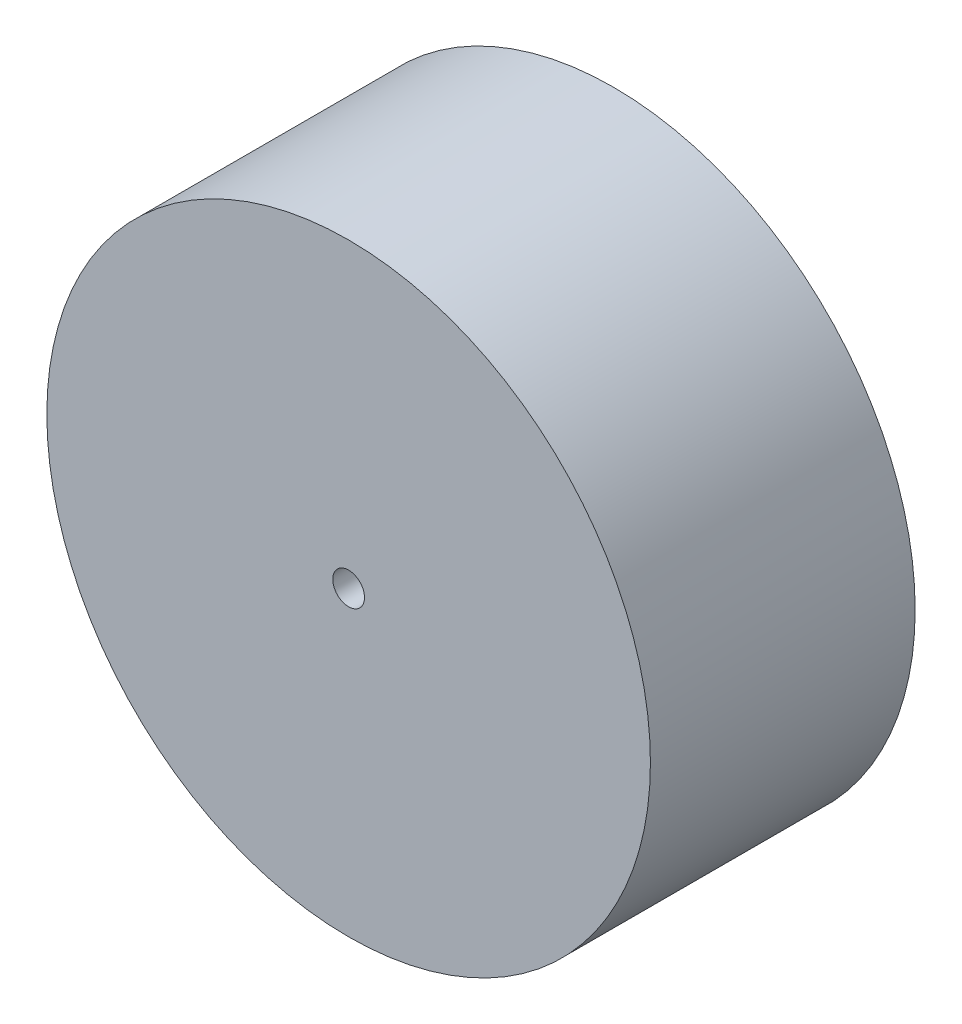
ISO-10303-21;
HEADER;
FILE_DESCRIPTION(('STEP AP214'),'2;1');
FILE_NAME('part.step','',(''),(''),'','','');
FILE_SCHEMA(('AUTOMOTIVE_DESIGN { 1 0 10303 214 1 1 1 1 }'));
ENDSEC;
DATA;
#1=APPLICATION_CONTEXT('core data for automotive mechanical design processes');
#2=APPLICATION_PROTOCOL_DEFINITION('international standard','automotive_design',2000,#1);
#3=PRODUCT_CONTEXT('',#1,'mechanical');
#4=PRODUCT('Part','Part','',(#3));
#5=PRODUCT_RELATED_PRODUCT_CATEGORY('part','',(#4));
#6=PRODUCT_DEFINITION_FORMATION('','',#4);
#7=PRODUCT_DEFINITION_CONTEXT('part definition',#1,'design');
#8=PRODUCT_DEFINITION('design','',#6,#7);
#9=PRODUCT_DEFINITION_SHAPE('','',#8);
#10=(LENGTH_UNIT() NAMED_UNIT(*) SI_UNIT(.MILLI.,.METRE.));
#11=(NAMED_UNIT(*) PLANE_ANGLE_UNIT() SI_UNIT($,.RADIAN.));
#12=(NAMED_UNIT(*) SI_UNIT($,.STERADIAN.) SOLID_ANGLE_UNIT());
#13=UNCERTAINTY_MEASURE_WITH_UNIT(LENGTH_MEASURE(1.E-05),#10,'distance_accuracy_value','');
#14=(GEOMETRIC_REPRESENTATION_CONTEXT(3) GLOBAL_UNCERTAINTY_ASSIGNED_CONTEXT((#13)) GLOBAL_UNIT_ASSIGNED_CONTEXT((#10,
#11,#12)) REPRESENTATION_CONTEXT('',''));
#15=CARTESIAN_POINT('',(0.,0.,0.));
#16=DIRECTION('',(0.,0.,1.));
#17=DIRECTION('',(1.,0.,0.));
#18=AXIS2_PLACEMENT_3D('',#15,#16,#17);
#19=CARTESIAN_POINT('',(0.,0.,25.));
#20=DIRECTION('',(0.,0.,1.));
#21=DIRECTION('',(1.,0.,0.));
#22=AXIS2_PLACEMENT_3D('',#19,#20,#21);
#23=PLANE('',#22);
#24=CARTESIAN_POINT('',(0.,0.,25.));
#25=DIRECTION('',(0.,0.,1.));
#26=DIRECTION('',(1.,0.,0.));
#27=AXIS2_PLACEMENT_3D('',#24,#25,#26);
#28=CIRCLE('',#27,28.5);
#29=CARTESIAN_POINT('',(28.5,0.,25.));
#30=VERTEX_POINT('',#29);
#31=EDGE_CURVE('E10',#30,#30,#28,.T.);
#32=ORIENTED_EDGE('',*,*,#31,.T.);
#33=EDGE_LOOP('',(#32));
#34=FACE_BOUND('',#33,.T.);
#35=CARTESIAN_POINT('',(0.,0.,25.));
#36=DIRECTION('',(0.,0.,1.));
#37=DIRECTION('',(1.,0.,0.));
#38=AXIS2_PLACEMENT_3D('',#35,#36,#37);
#39=CIRCLE('',#38,1.5);
#40=CARTESIAN_POINT('',(1.5,0.,25.));
#41=VERTEX_POINT('',#40);
#42=EDGE_CURVE('E50',#41,#41,#39,.T.);
#43=ORIENTED_EDGE('',*,*,#42,.F.);
#44=EDGE_LOOP('',(#43));
#45=FACE_BOUND('',#44,.T.);
#46=ADVANCED_FACE('F37',(#34,#45),#23,.T.);
#47=CARTESIAN_POINT('',(0.,0.,0.));
#48=DIRECTION('',(0.,0.,1.));
#49=DIRECTION('',(1.,0.,0.));
#50=AXIS2_PLACEMENT_3D('',#47,#48,#49);
#51=PLANE('',#50);
#52=CARTESIAN_POINT('',(0.,0.,0.));
#53=DIRECTION('',(0.,0.,1.));
#54=DIRECTION('',(1.,0.,0.));
#55=AXIS2_PLACEMENT_3D('',#52,#53,#54);
#56=CIRCLE('',#55,28.5);
#57=CARTESIAN_POINT('',(28.5,0.,0.));
#58=VERTEX_POINT('',#57);
#59=EDGE_CURVE('E41',#58,#58,#56,.T.);
#60=ORIENTED_EDGE('',*,*,#59,.F.);
#61=EDGE_LOOP('',(#60));
#62=FACE_BOUND('',#61,.T.);
#63=CARTESIAN_POINT('',(0.,0.,0.));
#64=DIRECTION('',(0.,0.,1.));
#65=DIRECTION('',(1.,0.,0.));
#66=AXIS2_PLACEMENT_3D('',#63,#64,#65);
#67=CIRCLE('',#66,1.5);
#68=CARTESIAN_POINT('',(1.5,0.,0.));
#69=VERTEX_POINT('',#68);
#70=EDGE_CURVE('E52',#69,#69,#67,.T.);
#71=ORIENTED_EDGE('',*,*,#70,.T.);
#72=EDGE_LOOP('',(#71));
#73=FACE_BOUND('',#72,.T.);
#74=ADVANCED_FACE('F64',(#62,#73),#51,.F.);
#75=CARTESIAN_POINT('',(0.,0.,25.));
#76=DIRECTION('',(0.,0.,-1.));
#77=DIRECTION('',(-1.,0.,0.));
#78=AXIS2_PLACEMENT_3D('',#75,#76,#77);
#79=CYLINDRICAL_SURFACE('',#78,28.5);
#80=ORIENTED_EDGE('',*,*,#31,.F.);
#81=EDGE_LOOP('',(#80));
#82=FACE_BOUND('',#81,.T.);
#83=ORIENTED_EDGE('',*,*,#59,.T.);
#84=EDGE_LOOP('',(#83));
#85=FACE_BOUND('',#84,.T.);
#86=ADVANCED_FACE('F39',(#82,#85),#79,.T.);
#87=CARTESIAN_POINT('',(0.,0.,25.));
#88=DIRECTION('',(0.,0.,-1.));
#89=DIRECTION('',(-1.,0.,0.));
#90=AXIS2_PLACEMENT_3D('',#87,#88,#89);
#91=CYLINDRICAL_SURFACE('',#90,1.5);
#92=ORIENTED_EDGE('',*,*,#42,.T.);
#93=EDGE_LOOP('',(#92));
#94=FACE_BOUND('',#93,.T.);
#95=ORIENTED_EDGE('',*,*,#70,.F.);
#96=EDGE_LOOP('',(#95));
#97=FACE_BOUND('',#96,.T.);
#98=ADVANCED_FACE('F60',(#94,#97),#91,.F.);
#99=CLOSED_SHELL('',(#46,#74,#86,#98));
#100=MANIFOLD_SOLID_BREP('B2',#99);
#101=ADVANCED_BREP_SHAPE_REPRESENTATION('',(#18,#100),#14);
#102=SHAPE_DEFINITION_REPRESENTATION(#9,#101);
ENDSEC;
END-ISO-10303-21;
